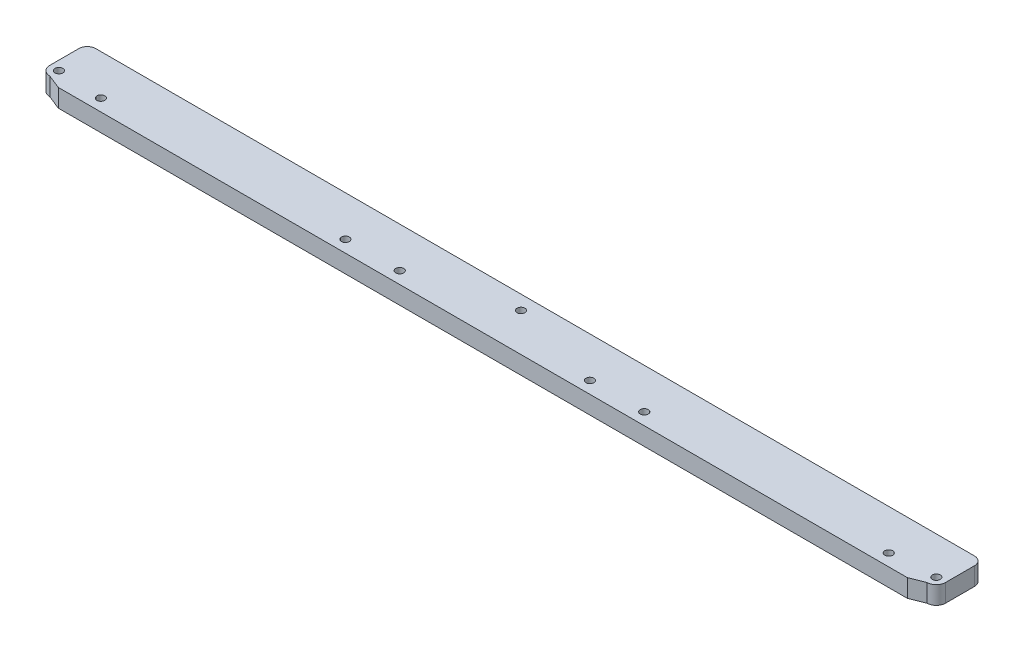
ISO-10303-21;
HEADER;
FILE_DESCRIPTION(('STEP AP214'),'2;1');
FILE_NAME('part.step','',(''),(''),'','','');
FILE_SCHEMA(('AUTOMOTIVE_DESIGN { 1 0 10303 214 1 1 1 1 }'));
ENDSEC;
DATA;
#1=APPLICATION_CONTEXT('core data for automotive mechanical design processes');
#2=APPLICATION_PROTOCOL_DEFINITION('international standard','automotive_design',2000,#1);
#3=PRODUCT_CONTEXT('',#1,'mechanical');
#4=PRODUCT('Part','Part','',(#3));
#5=PRODUCT_RELATED_PRODUCT_CATEGORY('part','',(#4));
#6=PRODUCT_DEFINITION_FORMATION('','',#4);
#7=PRODUCT_DEFINITION_CONTEXT('part definition',#1,'design');
#8=PRODUCT_DEFINITION('design','',#6,#7);
#9=PRODUCT_DEFINITION_SHAPE('','',#8);
#10=(LENGTH_UNIT() NAMED_UNIT(*) SI_UNIT(.MILLI.,.METRE.));
#11=(NAMED_UNIT(*) PLANE_ANGLE_UNIT() SI_UNIT($,.RADIAN.));
#12=(NAMED_UNIT(*) SI_UNIT($,.STERADIAN.) SOLID_ANGLE_UNIT());
#13=UNCERTAINTY_MEASURE_WITH_UNIT(LENGTH_MEASURE(1.E-05),#10,'distance_accuracy_value','');
#14=(GEOMETRIC_REPRESENTATION_CONTEXT(3) GLOBAL_UNCERTAINTY_ASSIGNED_CONTEXT((#13)) GLOBAL_UNIT_ASSIGNED_CONTEXT((#10,
#11,#12)) REPRESENTATION_CONTEXT('',''));
#15=CARTESIAN_POINT('',(0.,0.,0.));
#16=DIRECTION('',(0.,0.,1.));
#17=DIRECTION('',(1.,0.,0.));
#18=AXIS2_PLACEMENT_3D('',#15,#16,#17);
#19=CARTESIAN_POINT('',(0.,6.35,5.25000000000001));
#20=DIRECTION('',(0.,0.,-1.));
#21=DIRECTION('',(-1.,0.,0.));
#22=AXIS2_PLACEMENT_3D('',#19,#20,#21);
#23=PLANE('',#22);
#24=DIRECTION('',(1.,0.,0.));
#25=VECTOR('',#24,1.);
#26=CARTESIAN_POINT('',(0.,0.,5.25000000000001));
#27=LINE('',#26,#25);
#28=CARTESIAN_POINT('',(-150.,0.,5.25000000000001));
#29=VERTEX_POINT('',#28);
#30=CARTESIAN_POINT('',(150.,0.,5.25000000000001));
#31=VERTEX_POINT('',#30);
#32=EDGE_CURVE('E142',#29,#31,#27,.T.);
#33=ORIENTED_EDGE('',*,*,#32,.T.);
#34=DIRECTION('',(0.,-1.,0.));
#35=VECTOR('',#34,1.);
#36=CARTESIAN_POINT('',(150.,6.35,5.25000000000001));
#37=LINE('',#36,#35);
#38=CARTESIAN_POINT('',(150.,6.35,5.25000000000001));
#39=VERTEX_POINT('',#38);
#40=EDGE_CURVE('E124',#39,#31,#37,.T.);
#41=ORIENTED_EDGE('',*,*,#40,.F.);
#42=DIRECTION('',(1.,0.,0.));
#43=VECTOR('',#42,1.);
#44=CARTESIAN_POINT('',(0.,6.35,5.25000000000001));
#45=LINE('',#44,#43);
#46=CARTESIAN_POINT('',(-150.,6.35,5.25000000000001));
#47=VERTEX_POINT('',#46);
#48=EDGE_CURVE('E130',#47,#39,#45,.T.);
#49=ORIENTED_EDGE('',*,*,#48,.F.);
#50=DIRECTION('',(0.,-1.,0.));
#51=VECTOR('',#50,1.);
#52=CARTESIAN_POINT('',(-150.,6.35,5.25000000000001));
#53=LINE('',#52,#51);
#54=EDGE_CURVE('E204',#47,#29,#53,.T.);
#55=ORIENTED_EDGE('',*,*,#54,.T.);
#56=EDGE_LOOP('',(#33,#41,#49,#55));
#57=FACE_BOUND('',#56,.T.);
#58=ADVANCED_FACE('F39',(#57),#23,.F.);
#59=CARTESIAN_POINT('',(22.4999999999998,6.35,56.2499999999998));
#60=DIRECTION('',(-0.371390676354102,0.,-0.92847669088526));
#61=DIRECTION('',(-0.92847669088526,0.,0.371390676354102));
#62=AXIS2_PLACEMENT_3D('',#59,#60,#61);
#63=PLANE('',#62);
#64=DIRECTION('',(0.92847669088526,0.,-0.371390676354102));
#65=VECTOR('',#64,1.);
#66=CARTESIAN_POINT('',(22.4999999999998,0.,56.2499999999998));
#67=LINE('',#66,#65);
#68=CARTESIAN_POINT('',(155.,0.,3.25000000000001));
#69=VERTEX_POINT('',#68);
#70=EDGE_CURVE('E186',#31,#69,#67,.T.);
#71=ORIENTED_EDGE('',*,*,#70,.T.);
#72=DIRECTION('',(0.,-1.,0.));
#73=VECTOR('',#72,1.);
#74=CARTESIAN_POINT('',(155.,6.35,3.25000000000001));
#75=LINE('',#74,#73);
#76=CARTESIAN_POINT('',(155.,6.35,3.25000000000001));
#77=VERTEX_POINT('',#76);
#78=EDGE_CURVE('E126',#77,#69,#75,.T.);
#79=ORIENTED_EDGE('',*,*,#78,.F.);
#80=DIRECTION('',(0.92847669088526,0.,-0.371390676354102));
#81=VECTOR('',#80,1.);
#82=CARTESIAN_POINT('',(22.4999999999998,6.35,56.2499999999998));
#83=LINE('',#82,#81);
#84=EDGE_CURVE('E119',#39,#77,#83,.T.);
#85=ORIENTED_EDGE('',*,*,#84,.F.);
#86=ORIENTED_EDGE('',*,*,#40,.T.);
#87=EDGE_LOOP('',(#71,#79,#85,#86));
#88=FACE_BOUND('',#87,.T.);
#89=ADVANCED_FACE('F122',(#88),#63,.F.);
#90=CARTESIAN_POINT('',(155.,6.35,0.));
#91=DIRECTION('',(0.,-1.,0.));
#92=DIRECTION('',(0.,0.,-1.));
#93=AXIS2_PLACEMENT_3D('',#90,#91,#92);
#94=CYLINDRICAL_SURFACE('',#93,3.25000000000001);
#95=CARTESIAN_POINT('',(155.,0.,0.));
#96=DIRECTION('',(0.,1.,0.));
#97=DIRECTION('',(0.,0.,1.));
#98=AXIS2_PLACEMENT_3D('',#95,#96,#97);
#99=CIRCLE('',#98,3.25000000000001);
#100=CARTESIAN_POINT('',(158.25,0.,0.));
#101=VERTEX_POINT('',#100);
#102=EDGE_CURVE('E182',#101,#69,#99,.F.);
#103=ORIENTED_EDGE('',*,*,#102,.F.);
#104=DIRECTION('',(0.,-1.,0.));
#105=VECTOR('',#104,1.);
#106=CARTESIAN_POINT('',(158.25,6.35,0.));
#107=LINE('',#106,#105);
#108=CARTESIAN_POINT('',(158.25,6.35,0.));
#109=VERTEX_POINT('',#108);
#110=EDGE_CURVE('E147',#109,#101,#107,.T.);
#111=ORIENTED_EDGE('',*,*,#110,.F.);
#112=CARTESIAN_POINT('',(155.,6.35,0.));
#113=DIRECTION('',(0.,1.,0.));
#114=DIRECTION('',(0.,0.,1.));
#115=AXIS2_PLACEMENT_3D('',#112,#113,#114);
#116=CIRCLE('',#115,3.25000000000001);
#117=EDGE_CURVE('E129',#109,#77,#116,.F.);
#118=ORIENTED_EDGE('',*,*,#117,.T.);
#119=ORIENTED_EDGE('',*,*,#78,.T.);
#120=EDGE_LOOP('',(#103,#111,#118,#119));
#121=FACE_BOUND('',#120,.T.);
#122=ADVANCED_FACE('F236',(#121),#94,.T.);
#123=CARTESIAN_POINT('',(158.25,6.35,0.));
#124=DIRECTION('',(1.,0.,0.));
#125=DIRECTION('',(0.,0.,-1.));
#126=AXIS2_PLACEMENT_3D('',#123,#124,#125);
#127=PLANE('',#126);
#128=DIRECTION('',(0.,0.,1.));
#129=VECTOR('',#128,1.);
#130=CARTESIAN_POINT('',(158.25,0.,0.));
#131=LINE('',#130,#129);
#132=CARTESIAN_POINT('',(158.25,0.,-10.25));
#133=VERTEX_POINT('',#132);
#134=EDGE_CURVE('E176',#133,#101,#131,.T.);
#135=ORIENTED_EDGE('',*,*,#134,.F.);
#136=DIRECTION('',(0.,-1.,0.));
#137=VECTOR('',#136,1.);
#138=CARTESIAN_POINT('',(158.25,6.35,-10.25));
#139=LINE('',#138,#137);
#140=CARTESIAN_POINT('',(158.25,6.35,-10.25));
#141=VERTEX_POINT('',#140);
#142=EDGE_CURVE('E62',#133,#141,#139,.F.);
#143=ORIENTED_EDGE('',*,*,#142,.T.);
#144=DIRECTION('',(0.,0.,1.));
#145=VECTOR('',#144,1.);
#146=CARTESIAN_POINT('',(158.25,6.35,0.));
#147=LINE('',#146,#145);
#148=EDGE_CURVE('E161',#141,#109,#147,.T.);
#149=ORIENTED_EDGE('',*,*,#148,.T.);
#150=ORIENTED_EDGE('',*,*,#110,.T.);
#151=EDGE_LOOP('',(#135,#143,#149,#150));
#152=FACE_BOUND('',#151,.T.);
#153=ADVANCED_FACE('F179',(#152),#127,.T.);
#154=CARTESIAN_POINT('',(0.,6.35,-13.25));
#155=DIRECTION('',(0.,0.,-1.));
#156=DIRECTION('',(-1.,0.,0.));
#157=AXIS2_PLACEMENT_3D('',#154,#155,#156);
#158=PLANE('',#157);
#159=DIRECTION('',(1.,0.,0.));
#160=VECTOR('',#159,1.);
#161=CARTESIAN_POINT('',(0.,6.35,-13.25));
#162=LINE('',#161,#160);
#163=CARTESIAN_POINT('',(-155.25,6.35,-13.25));
#164=VERTEX_POINT('',#163);
#165=CARTESIAN_POINT('',(155.25,6.35,-13.25));
#166=VERTEX_POINT('',#165);
#167=EDGE_CURVE('E160',#164,#166,#162,.T.);
#168=ORIENTED_EDGE('',*,*,#167,.T.);
#169=DIRECTION('',(0.,-1.,0.));
#170=VECTOR('',#169,1.);
#171=CARTESIAN_POINT('',(155.25,6.35,-13.25));
#172=LINE('',#171,#170);
#173=CARTESIAN_POINT('',(155.25,0.,-13.25));
#174=VERTEX_POINT('',#173);
#175=EDGE_CURVE('E145',#166,#174,#172,.T.);
#176=ORIENTED_EDGE('',*,*,#175,.T.);
#177=DIRECTION('',(1.,0.,0.));
#178=VECTOR('',#177,1.);
#179=CARTESIAN_POINT('',(0.,0.,-13.25));
#180=LINE('',#179,#178);
#181=CARTESIAN_POINT('',(-155.25,0.,-13.25));
#182=VERTEX_POINT('',#181);
#183=EDGE_CURVE('E178',#182,#174,#180,.T.);
#184=ORIENTED_EDGE('',*,*,#183,.F.);
#185=DIRECTION('',(0.,-1.,0.));
#186=VECTOR('',#185,1.);
#187=CARTESIAN_POINT('',(-155.25,6.35,-13.25));
#188=LINE('',#187,#186);
#189=EDGE_CURVE('E143',#182,#164,#188,.F.);
#190=ORIENTED_EDGE('',*,*,#189,.T.);
#191=EDGE_LOOP('',(#168,#176,#184,#190));
#192=FACE_BOUND('',#191,.T.);
#193=ADVANCED_FACE('F165',(#192),#158,.T.);
#194=CARTESIAN_POINT('',(-158.25,6.35,0.));
#195=DIRECTION('',(-1.,0.,0.));
#196=DIRECTION('',(0.,0.,1.));
#197=AXIS2_PLACEMENT_3D('',#194,#195,#196);
#198=PLANE('',#197);
#199=DIRECTION('',(0.,0.,-1.));
#200=VECTOR('',#199,1.);
#201=CARTESIAN_POINT('',(-158.25,6.35,0.));
#202=LINE('',#201,#200);
#203=CARTESIAN_POINT('',(-158.25,6.35,0.));
#204=VERTEX_POINT('',#203);
#205=CARTESIAN_POINT('',(-158.25,6.35,-10.25));
#206=VERTEX_POINT('',#205);
#207=EDGE_CURVE('E169',#204,#206,#202,.T.);
#208=ORIENTED_EDGE('',*,*,#207,.T.);
#209=DIRECTION('',(0.,-1.,0.));
#210=VECTOR('',#209,1.);
#211=CARTESIAN_POINT('',(-158.25,6.35,-10.25));
#212=LINE('',#211,#210);
#213=CARTESIAN_POINT('',(-158.25,0.,-10.25));
#214=VERTEX_POINT('',#213);
#215=EDGE_CURVE('E11',#206,#214,#212,.T.);
#216=ORIENTED_EDGE('',*,*,#215,.T.);
#217=DIRECTION('',(0.,0.,-1.));
#218=VECTOR('',#217,1.);
#219=CARTESIAN_POINT('',(-158.25,0.,0.));
#220=LINE('',#219,#218);
#221=CARTESIAN_POINT('',(-158.25,0.,0.));
#222=VERTEX_POINT('',#221);
#223=EDGE_CURVE('E184',#222,#214,#220,.T.);
#224=ORIENTED_EDGE('',*,*,#223,.F.);
#225=DIRECTION('',(0.,-1.,0.));
#226=VECTOR('',#225,1.);
#227=CARTESIAN_POINT('',(-158.25,6.35,0.));
#228=LINE('',#227,#226);
#229=EDGE_CURVE('E209',#204,#222,#228,.T.);
#230=ORIENTED_EDGE('',*,*,#229,.F.);
#231=EDGE_LOOP('',(#208,#216,#224,#230));
#232=FACE_BOUND('',#231,.T.);
#233=ADVANCED_FACE('F219',(#232),#198,.T.);
#234=CARTESIAN_POINT('',(-155.,6.35,0.));
#235=DIRECTION('',(0.,-1.,0.));
#236=DIRECTION('',(0.,0.,-1.));
#237=AXIS2_PLACEMENT_3D('',#234,#235,#236);
#238=CYLINDRICAL_SURFACE('',#237,3.25000000000001);
#239=CARTESIAN_POINT('',(-155.,0.,0.));
#240=DIRECTION('',(0.,1.,0.));
#241=DIRECTION('',(0.,0.,1.));
#242=AXIS2_PLACEMENT_3D('',#239,#240,#241);
#243=CIRCLE('',#242,3.25000000000001);
#244=CARTESIAN_POINT('',(-155.,0.,3.25000000000001));
#245=VERTEX_POINT('',#244);
#246=EDGE_CURVE('E192',#222,#245,#243,.T.);
#247=ORIENTED_EDGE('',*,*,#246,.T.);
#248=DIRECTION('',(0.,-1.,0.));
#249=VECTOR('',#248,1.);
#250=CARTESIAN_POINT('',(-155.,6.35,3.25000000000001));
#251=LINE('',#250,#249);
#252=CARTESIAN_POINT('',(-155.,6.35,3.25000000000001));
#253=VERTEX_POINT('',#252);
#254=EDGE_CURVE('E206',#253,#245,#251,.T.);
#255=ORIENTED_EDGE('',*,*,#254,.F.);
#256=CARTESIAN_POINT('',(-155.,6.35,0.));
#257=DIRECTION('',(0.,1.,0.));
#258=DIRECTION('',(0.,0.,1.));
#259=AXIS2_PLACEMENT_3D('',#256,#257,#258);
#260=CIRCLE('',#259,3.25000000000001);
#261=EDGE_CURVE('E215',#204,#253,#260,.T.);
#262=ORIENTED_EDGE('',*,*,#261,.F.);
#263=ORIENTED_EDGE('',*,*,#229,.T.);
#264=EDGE_LOOP('',(#247,#255,#262,#263));
#265=FACE_BOUND('',#264,.T.);
#266=ADVANCED_FACE('F213',(#265),#238,.T.);
#267=CARTESIAN_POINT('',(-155.,6.35,0.));
#268=DIRECTION('',(0.,-1.,0.));
#269=DIRECTION('',(0.,0.,-1.));
#270=AXIS2_PLACEMENT_3D('',#267,#268,#269);
#271=CYLINDRICAL_SURFACE('',#270,1.4);
#272=CARTESIAN_POINT('',(-155.,6.35,0.));
#273=DIRECTION('',(0.,1.,0.));
#274=DIRECTION('',(0.,0.,1.));
#275=AXIS2_PLACEMENT_3D('',#272,#273,#274);
#276=CIRCLE('',#275,1.4);
#277=CARTESIAN_POINT('',(-155.,6.35,1.4));
#278=VERTEX_POINT('',#277);
#279=EDGE_CURVE('E275',#278,#278,#276,.T.);
#280=ORIENTED_EDGE('',*,*,#279,.T.);
#281=EDGE_LOOP('',(#280));
#282=FACE_BOUND('',#281,.T.);
#283=CARTESIAN_POINT('',(-155.,0.,0.));
#284=DIRECTION('',(0.,1.,0.));
#285=DIRECTION('',(0.,0.,1.));
#286=AXIS2_PLACEMENT_3D('',#283,#284,#285);
#287=CIRCLE('',#286,1.4);
#288=CARTESIAN_POINT('',(-155.,0.,1.4));
#289=VERTEX_POINT('',#288);
#290=EDGE_CURVE('E198',#289,#289,#287,.T.);
#291=ORIENTED_EDGE('',*,*,#290,.F.);
#292=EDGE_LOOP('',(#291));
#293=FACE_BOUND('',#292,.T.);
#294=ADVANCED_FACE('F251',(#282,#293),#271,.F.);
#295=CARTESIAN_POINT('',(-22.4999999999993,6.35,56.2499999999994));
#296=DIRECTION('',(-0.371390676354098,0.,0.928476690885262));
#297=DIRECTION('',(0.928476690885262,0.,0.371390676354098));
#298=AXIS2_PLACEMENT_3D('',#295,#296,#297);
#299=PLANE('',#298);
#300=DIRECTION('',(-0.928476690885262,0.,-0.371390676354098));
#301=VECTOR('',#300,1.);
#302=CARTESIAN_POINT('',(-22.4999999999993,0.,56.2499999999994));
#303=LINE('',#302,#301);
#304=EDGE_CURVE('E195',#29,#245,#303,.T.);
#305=ORIENTED_EDGE('',*,*,#304,.F.);
#306=ORIENTED_EDGE('',*,*,#54,.F.);
#307=DIRECTION('',(-0.928476690885262,0.,-0.371390676354098));
#308=VECTOR('',#307,1.);
#309=CARTESIAN_POINT('',(-22.4999999999993,6.35,56.2499999999994));
#310=LINE('',#309,#308);
#311=EDGE_CURVE('E137',#47,#253,#310,.T.);
#312=ORIENTED_EDGE('',*,*,#311,.T.);
#313=ORIENTED_EDGE('',*,*,#254,.T.);
#314=EDGE_LOOP('',(#305,#306,#312,#313));
#315=FACE_BOUND('',#314,.T.);
#316=ADVANCED_FACE('F243',(#315),#299,.T.);
#317=CARTESIAN_POINT('',(155.,6.35,0.));
#318=DIRECTION('',(0.,-1.,0.));
#319=DIRECTION('',(0.,0.,-1.));
#320=AXIS2_PLACEMENT_3D('',#317,#318,#319);
#321=CYLINDRICAL_SURFACE('',#320,1.4);
#322=CARTESIAN_POINT('',(155.,6.35,0.));
#323=DIRECTION('',(0.,1.,0.));
#324=DIRECTION('',(0.,0.,1.));
#325=AXIS2_PLACEMENT_3D('',#322,#323,#324);
#326=CIRCLE('',#325,1.4);
#327=CARTESIAN_POINT('',(155.,6.35,1.4));
#328=VERTEX_POINT('',#327);
#329=EDGE_CURVE('E139',#328,#328,#326,.T.);
#330=ORIENTED_EDGE('',*,*,#329,.T.);
#331=EDGE_LOOP('',(#330));
#332=FACE_BOUND('',#331,.T.);
#333=CARTESIAN_POINT('',(155.,0.,0.));
#334=DIRECTION('',(0.,1.,0.));
#335=DIRECTION('',(0.,0.,1.));
#336=AXIS2_PLACEMENT_3D('',#333,#334,#335);
#337=CIRCLE('',#336,1.4);
#338=CARTESIAN_POINT('',(155.,0.,1.4));
#339=VERTEX_POINT('',#338);
#340=EDGE_CURVE('E259',#339,#339,#337,.T.);
#341=ORIENTED_EDGE('',*,*,#340,.F.);
#342=EDGE_LOOP('',(#341));
#343=FACE_BOUND('',#342,.T.);
#344=ADVANCED_FACE('F240',(#332,#343),#321,.F.);
#345=CARTESIAN_POINT('',(0.,6.35,-8.25000000000001));
#346=DIRECTION('',(0.,-1.,0.));
#347=DIRECTION('',(0.,0.,-1.));
#348=AXIS2_PLACEMENT_3D('',#345,#346,#347);
#349=CYLINDRICAL_SURFACE('',#348,1.4);
#350=CARTESIAN_POINT('',(0.,6.35,-8.25000000000001));
#351=DIRECTION('',(0.,1.,0.));
#352=DIRECTION('',(0.,0.,1.));
#353=AXIS2_PLACEMENT_3D('',#350,#351,#352);
#354=CIRCLE('',#353,1.4);
#355=CARTESIAN_POINT('',(0.,6.35,-6.85000000000001));
#356=VERTEX_POINT('',#355);
#357=EDGE_CURVE('E207',#356,#356,#354,.T.);
#358=ORIENTED_EDGE('',*,*,#357,.T.);
#359=EDGE_LOOP('',(#358));
#360=FACE_BOUND('',#359,.T.);
#361=CARTESIAN_POINT('',(0.,0.,-8.25000000000001));
#362=DIRECTION('',(0.,1.,0.));
#363=DIRECTION('',(0.,0.,1.));
#364=AXIS2_PLACEMENT_3D('',#361,#362,#363);
#365=CIRCLE('',#364,1.4);
#366=CARTESIAN_POINT('',(0.,0.,-6.85000000000001));
#367=VERTEX_POINT('',#366);
#368=EDGE_CURVE('E201',#367,#367,#365,.T.);
#369=ORIENTED_EDGE('',*,*,#368,.F.);
#370=EDGE_LOOP('',(#369));
#371=FACE_BOUND('',#370,.T.);
#372=ADVANCED_FACE('F242',(#360,#371),#349,.F.);
#373=CARTESIAN_POINT('',(0.,6.35,0.));
#374=DIRECTION('',(0.,1.,0.));
#375=DIRECTION('',(0.,0.,1.));
#376=AXIS2_PLACEMENT_3D('',#373,#374,#375);
#377=PLANE('',#376);
#378=CARTESIAN_POINT('',(33.6,6.35,0.999999999999979));
#379=DIRECTION('',(0.,1.,0.));
#380=DIRECTION('',(0.,0.,-1.));
#381=AXIS2_PLACEMENT_3D('',#378,#379,#380);
#382=CIRCLE('',#381,1.4);
#383=CARTESIAN_POINT('',(33.6,6.35,-0.400000000000017));
#384=VERTEX_POINT('',#383);
#385=EDGE_CURVE('E468',#384,#384,#382,.T.);
#386=ORIENTED_EDGE('',*,*,#385,.F.);
#387=EDGE_LOOP('',(#386));
#388=FACE_BOUND('',#387,.T.);
#389=CARTESIAN_POINT('',(52.8,6.35,0.999999999999974));
#390=DIRECTION('',(0.,1.,0.));
#391=DIRECTION('',(0.,0.,-1.));
#392=AXIS2_PLACEMENT_3D('',#389,#390,#391);
#393=CIRCLE('',#392,1.4);
#394=CARTESIAN_POINT('',(52.8,6.35,-0.400000000000029));
#395=VERTEX_POINT('',#394);
#396=EDGE_CURVE('E470',#395,#395,#393,.T.);
#397=ORIENTED_EDGE('',*,*,#396,.F.);
#398=EDGE_LOOP('',(#397));
#399=FACE_BOUND('',#398,.T.);
#400=CARTESIAN_POINT('',(139.2,6.35,0.999999999999921));
#401=DIRECTION('',(0.,1.,0.));
#402=DIRECTION('',(0.,0.,-1.));
#403=AXIS2_PLACEMENT_3D('',#400,#401,#402);
#404=CIRCLE('',#403,1.4);
#405=CARTESIAN_POINT('',(139.2,6.35,-0.400000000000082));
#406=VERTEX_POINT('',#405);
#407=EDGE_CURVE('E476',#406,#406,#404,.T.);
#408=ORIENTED_EDGE('',*,*,#407,.F.);
#409=EDGE_LOOP('',(#408));
#410=FACE_BOUND('',#409,.T.);
#411=CARTESIAN_POINT('',(-139.2,6.35,0.999999999999955));
#412=DIRECTION('',(0.,1.,0.));
#413=DIRECTION('',(0.,0.,1.));
#414=AXIS2_PLACEMENT_3D('',#411,#412,#413);
#415=CIRCLE('',#414,1.4);
#416=CARTESIAN_POINT('',(-139.2,6.35,2.39999999999996));
#417=VERTEX_POINT('',#416);
#418=EDGE_CURVE('E482',#417,#417,#415,.T.);
#419=ORIENTED_EDGE('',*,*,#418,.F.);
#420=EDGE_LOOP('',(#419));
#421=FACE_BOUND('',#420,.T.);
#422=CARTESIAN_POINT('',(-52.8,6.35,0.999999999999987));
#423=DIRECTION('',(0.,1.,0.));
#424=DIRECTION('',(0.,0.,1.));
#425=AXIS2_PLACEMENT_3D('',#422,#423,#424);
#426=CIRCLE('',#425,1.4);
#427=CARTESIAN_POINT('',(-52.8,6.35,2.39999999999999));
#428=VERTEX_POINT('',#427);
#429=EDGE_CURVE('E488',#428,#428,#426,.T.);
#430=ORIENTED_EDGE('',*,*,#429,.F.);
#431=EDGE_LOOP('',(#430));
#432=FACE_BOUND('',#431,.T.);
#433=CARTESIAN_POINT('',(-33.6,6.35,0.999999999999987));
#434=DIRECTION('',(0.,1.,0.));
#435=DIRECTION('',(0.,0.,1.));
#436=AXIS2_PLACEMENT_3D('',#433,#434,#435);
#437=CIRCLE('',#436,1.4);
#438=CARTESIAN_POINT('',(-33.6,6.35,2.39999999999998));
#439=VERTEX_POINT('',#438);
#440=EDGE_CURVE('E265',#439,#439,#437,.T.);
#441=ORIENTED_EDGE('',*,*,#440,.F.);
#442=EDGE_LOOP('',(#441));
#443=FACE_BOUND('',#442,.T.);
#444=ORIENTED_EDGE('',*,*,#329,.F.);
#445=EDGE_LOOP('',(#444));
#446=FACE_BOUND('',#445,.T.);
#447=ORIENTED_EDGE('',*,*,#148,.F.);
#448=CARTESIAN_POINT('',(155.25,6.35,-10.25));
#449=DIRECTION('',(0.,1.,0.));
#450=DIRECTION('',(0.,0.,1.));
#451=AXIS2_PLACEMENT_3D('',#448,#449,#450);
#452=CIRCLE('',#451,3.);
#453=EDGE_CURVE('E47',#141,#166,#452,.T.);
#454=ORIENTED_EDGE('',*,*,#453,.T.);
#455=ORIENTED_EDGE('',*,*,#167,.F.);
#456=CARTESIAN_POINT('',(-155.25,6.35,-10.25));
#457=DIRECTION('',(0.,1.,0.));
#458=DIRECTION('',(0.,0.,1.));
#459=AXIS2_PLACEMENT_3D('',#456,#457,#458);
#460=CIRCLE('',#459,3.);
#461=EDGE_CURVE('E54',#164,#206,#460,.T.);
#462=ORIENTED_EDGE('',*,*,#461,.T.);
#463=ORIENTED_EDGE('',*,*,#207,.F.);
#464=ORIENTED_EDGE('',*,*,#261,.T.);
#465=ORIENTED_EDGE('',*,*,#311,.F.);
#466=ORIENTED_EDGE('',*,*,#48,.T.);
#467=ORIENTED_EDGE('',*,*,#84,.T.);
#468=ORIENTED_EDGE('',*,*,#117,.F.);
#469=EDGE_LOOP('',(#447,#454,#455,#462,#463,#464,#465,#466,#467,#468));
#470=FACE_BOUND('',#469,.T.);
#471=ORIENTED_EDGE('',*,*,#279,.F.);
#472=EDGE_LOOP('',(#471));
#473=FACE_BOUND('',#472,.T.);
#474=ORIENTED_EDGE('',*,*,#357,.F.);
#475=EDGE_LOOP('',(#474));
#476=FACE_BOUND('',#475,.T.);
#477=ADVANCED_FACE('F134',(#388,#399,#410,#421,#432,#443,#446,#470,#473,#476),#377,.T.);
#478=CARTESIAN_POINT('',(0.,0.,0.));
#479=DIRECTION('',(0.,1.,0.));
#480=DIRECTION('',(0.,0.,1.));
#481=AXIS2_PLACEMENT_3D('',#478,#479,#480);
#482=PLANE('',#481);
#483=CARTESIAN_POINT('',(33.6,0.,0.999999999999979));
#484=DIRECTION('',(0.,1.,0.));
#485=DIRECTION('',(0.,0.,-1.));
#486=AXIS2_PLACEMENT_3D('',#483,#484,#485);
#487=CIRCLE('',#486,1.4);
#488=CARTESIAN_POINT('',(33.6,0.,-0.400000000000017));
#489=VERTEX_POINT('',#488);
#490=EDGE_CURVE('E466',#489,#489,#487,.T.);
#491=ORIENTED_EDGE('',*,*,#490,.T.);
#492=EDGE_LOOP('',(#491));
#493=FACE_BOUND('',#492,.T.);
#494=CARTESIAN_POINT('',(52.8,0.,0.999999999999974));
#495=DIRECTION('',(0.,1.,0.));
#496=DIRECTION('',(0.,0.,-1.));
#497=AXIS2_PLACEMENT_3D('',#494,#495,#496);
#498=CIRCLE('',#497,1.4);
#499=CARTESIAN_POINT('',(52.8,0.,-0.400000000000029));
#500=VERTEX_POINT('',#499);
#501=EDGE_CURVE('E473',#500,#500,#498,.T.);
#502=ORIENTED_EDGE('',*,*,#501,.T.);
#503=EDGE_LOOP('',(#502));
#504=FACE_BOUND('',#503,.T.);
#505=CARTESIAN_POINT('',(139.2,0.,0.999999999999921));
#506=DIRECTION('',(0.,1.,0.));
#507=DIRECTION('',(0.,0.,-1.));
#508=AXIS2_PLACEMENT_3D('',#505,#506,#507);
#509=CIRCLE('',#508,1.4);
#510=CARTESIAN_POINT('',(139.2,0.,-0.400000000000082));
#511=VERTEX_POINT('',#510);
#512=EDGE_CURVE('E479',#511,#511,#509,.T.);
#513=ORIENTED_EDGE('',*,*,#512,.T.);
#514=EDGE_LOOP('',(#513));
#515=FACE_BOUND('',#514,.T.);
#516=CARTESIAN_POINT('',(-139.2,0.,0.999999999999955));
#517=DIRECTION('',(0.,1.,0.));
#518=DIRECTION('',(0.,0.,1.));
#519=AXIS2_PLACEMENT_3D('',#516,#517,#518);
#520=CIRCLE('',#519,1.4);
#521=CARTESIAN_POINT('',(-139.2,0.,2.39999999999996));
#522=VERTEX_POINT('',#521);
#523=EDGE_CURVE('E485',#522,#522,#520,.T.);
#524=ORIENTED_EDGE('',*,*,#523,.T.);
#525=EDGE_LOOP('',(#524));
#526=FACE_BOUND('',#525,.T.);
#527=CARTESIAN_POINT('',(-52.8,0.,0.999999999999987));
#528=DIRECTION('',(0.,1.,0.));
#529=DIRECTION('',(0.,0.,1.));
#530=AXIS2_PLACEMENT_3D('',#527,#528,#529);
#531=CIRCLE('',#530,1.4);
#532=CARTESIAN_POINT('',(-52.8,0.,2.39999999999999));
#533=VERTEX_POINT('',#532);
#534=EDGE_CURVE('E491',#533,#533,#531,.T.);
#535=ORIENTED_EDGE('',*,*,#534,.T.);
#536=EDGE_LOOP('',(#535));
#537=FACE_BOUND('',#536,.T.);
#538=CARTESIAN_POINT('',(-33.6,0.,0.999999999999987));
#539=DIRECTION('',(0.,1.,0.));
#540=DIRECTION('',(0.,0.,1.));
#541=AXIS2_PLACEMENT_3D('',#538,#539,#540);
#542=CIRCLE('',#541,1.4);
#543=CARTESIAN_POINT('',(-33.6,0.,2.39999999999998));
#544=VERTEX_POINT('',#543);
#545=EDGE_CURVE('E261',#544,#544,#542,.T.);
#546=ORIENTED_EDGE('',*,*,#545,.T.);
#547=EDGE_LOOP('',(#546));
#548=FACE_BOUND('',#547,.T.);
#549=ORIENTED_EDGE('',*,*,#340,.T.);
#550=EDGE_LOOP('',(#549));
#551=FACE_BOUND('',#550,.T.);
#552=ORIENTED_EDGE('',*,*,#183,.T.);
#553=CARTESIAN_POINT('',(155.25,0.,-10.25));
#554=DIRECTION('',(0.,1.,0.));
#555=DIRECTION('',(0.,0.,1.));
#556=AXIS2_PLACEMENT_3D('',#553,#554,#555);
#557=CIRCLE('',#556,3.);
#558=EDGE_CURVE('E155',#174,#133,#557,.F.);
#559=ORIENTED_EDGE('',*,*,#558,.T.);
#560=ORIENTED_EDGE('',*,*,#134,.T.);
#561=ORIENTED_EDGE('',*,*,#102,.T.);
#562=ORIENTED_EDGE('',*,*,#70,.F.);
#563=ORIENTED_EDGE('',*,*,#32,.F.);
#564=ORIENTED_EDGE('',*,*,#304,.T.);
#565=ORIENTED_EDGE('',*,*,#246,.F.);
#566=ORIENTED_EDGE('',*,*,#223,.T.);
#567=CARTESIAN_POINT('',(-155.25,0.,-10.25));
#568=DIRECTION('',(0.,1.,0.));
#569=DIRECTION('',(0.,0.,1.));
#570=AXIS2_PLACEMENT_3D('',#567,#568,#569);
#571=CIRCLE('',#570,3.);
#572=EDGE_CURVE('E153',#214,#182,#571,.F.);
#573=ORIENTED_EDGE('',*,*,#572,.T.);
#574=EDGE_LOOP('',(#552,#559,#560,#561,#562,#563,#564,#565,#566,#573));
#575=FACE_BOUND('',#574,.T.);
#576=ORIENTED_EDGE('',*,*,#290,.T.);
#577=EDGE_LOOP('',(#576));
#578=FACE_BOUND('',#577,.T.);
#579=ORIENTED_EDGE('',*,*,#368,.T.);
#580=EDGE_LOOP('',(#579));
#581=FACE_BOUND('',#580,.T.);
#582=ADVANCED_FACE('F173',(#493,#504,#515,#526,#537,#548,#551,#575,#578,#581),#482,.F.);
#583=CARTESIAN_POINT('',(155.25,6.35,-10.25));
#584=DIRECTION('',(0.,-1.,0.));
#585=DIRECTION('',(0.,0.,-1.));
#586=AXIS2_PLACEMENT_3D('',#583,#584,#585);
#587=CYLINDRICAL_SURFACE('',#586,3.);
#588=ORIENTED_EDGE('',*,*,#453,.F.);
#589=ORIENTED_EDGE('',*,*,#142,.F.);
#590=ORIENTED_EDGE('',*,*,#558,.F.);
#591=ORIENTED_EDGE('',*,*,#175,.F.);
#592=EDGE_LOOP('',(#588,#589,#590,#591));
#593=FACE_BOUND('',#592,.T.);
#594=ADVANCED_FACE('F171',(#593),#587,.T.);
#595=CARTESIAN_POINT('',(-155.25,6.35,-10.25));
#596=DIRECTION('',(0.,-1.,0.));
#597=DIRECTION('',(0.,0.,-1.));
#598=AXIS2_PLACEMENT_3D('',#595,#596,#597);
#599=CYLINDRICAL_SURFACE('',#598,3.);
#600=ORIENTED_EDGE('',*,*,#461,.F.);
#601=ORIENTED_EDGE('',*,*,#189,.F.);
#602=ORIENTED_EDGE('',*,*,#572,.F.);
#603=ORIENTED_EDGE('',*,*,#215,.F.);
#604=EDGE_LOOP('',(#600,#601,#602,#603));
#605=FACE_BOUND('',#604,.T.);
#606=ADVANCED_FACE('F41',(#605),#599,.T.);
#607=CARTESIAN_POINT('',(-33.6,0.,0.999999999999987));
#608=DIRECTION('',(0.,1.,0.));
#609=DIRECTION('',(0.,0.,1.));
#610=AXIS2_PLACEMENT_3D('',#607,#608,#609);
#611=CYLINDRICAL_SURFACE('',#610,1.4);
#612=ORIENTED_EDGE('',*,*,#545,.F.);
#613=EDGE_LOOP('',(#612));
#614=FACE_BOUND('',#613,.T.);
#615=ORIENTED_EDGE('',*,*,#440,.T.);
#616=EDGE_LOOP('',(#615));
#617=FACE_BOUND('',#616,.T.);
#618=ADVANCED_FACE('F223',(#614,#617),#611,.F.);
#619=CARTESIAN_POINT('',(-52.8,0.,0.999999999999987));
#620=DIRECTION('',(0.,1.,0.));
#621=DIRECTION('',(0.,0.,1.));
#622=AXIS2_PLACEMENT_3D('',#619,#620,#621);
#623=CYLINDRICAL_SURFACE('',#622,1.4);
#624=ORIENTED_EDGE('',*,*,#534,.F.);
#625=EDGE_LOOP('',(#624));
#626=FACE_BOUND('',#625,.T.);
#627=ORIENTED_EDGE('',*,*,#429,.T.);
#628=EDGE_LOOP('',(#627));
#629=FACE_BOUND('',#628,.T.);
#630=ADVANCED_FACE('F228',(#626,#629),#623,.F.);
#631=CARTESIAN_POINT('',(-139.2,0.,0.999999999999955));
#632=DIRECTION('',(0.,1.,0.));
#633=DIRECTION('',(0.,0.,1.));
#634=AXIS2_PLACEMENT_3D('',#631,#632,#633);
#635=CYLINDRICAL_SURFACE('',#634,1.4);
#636=ORIENTED_EDGE('',*,*,#523,.F.);
#637=EDGE_LOOP('',(#636));
#638=FACE_BOUND('',#637,.T.);
#639=ORIENTED_EDGE('',*,*,#418,.T.);
#640=EDGE_LOOP('',(#639));
#641=FACE_BOUND('',#640,.T.);
#642=ADVANCED_FACE('F420',(#638,#641),#635,.F.);
#643=CARTESIAN_POINT('',(139.2,0.,0.999999999999921));
#644=DIRECTION('',(0.,1.,0.));
#645=DIRECTION('',(0.,0.,1.));
#646=AXIS2_PLACEMENT_3D('',#643,#644,#645);
#647=CYLINDRICAL_SURFACE('',#646,1.4);
#648=ORIENTED_EDGE('',*,*,#512,.F.);
#649=EDGE_LOOP('',(#648));
#650=FACE_BOUND('',#649,.T.);
#651=ORIENTED_EDGE('',*,*,#407,.T.);
#652=EDGE_LOOP('',(#651));
#653=FACE_BOUND('',#652,.T.);
#654=ADVANCED_FACE('F428',(#650,#653),#647,.F.);
#655=CARTESIAN_POINT('',(52.8,0.,0.999999999999974));
#656=DIRECTION('',(0.,1.,0.));
#657=DIRECTION('',(0.,0.,1.));
#658=AXIS2_PLACEMENT_3D('',#655,#656,#657);
#659=CYLINDRICAL_SURFACE('',#658,1.4);
#660=ORIENTED_EDGE('',*,*,#501,.F.);
#661=EDGE_LOOP('',(#660));
#662=FACE_BOUND('',#661,.T.);
#663=ORIENTED_EDGE('',*,*,#396,.T.);
#664=EDGE_LOOP('',(#663));
#665=FACE_BOUND('',#664,.T.);
#666=ADVANCED_FACE('F437',(#662,#665),#659,.F.);
#667=CARTESIAN_POINT('',(33.6,0.,0.999999999999979));
#668=DIRECTION('',(0.,1.,0.));
#669=DIRECTION('',(0.,0.,1.));
#670=AXIS2_PLACEMENT_3D('',#667,#668,#669);
#671=CYLINDRICAL_SURFACE('',#670,1.4);
#672=ORIENTED_EDGE('',*,*,#490,.F.);
#673=EDGE_LOOP('',(#672));
#674=FACE_BOUND('',#673,.T.);
#675=ORIENTED_EDGE('',*,*,#385,.T.);
#676=EDGE_LOOP('',(#675));
#677=FACE_BOUND('',#676,.T.);
#678=ADVANCED_FACE('F446',(#674,#677),#671,.F.);
#679=CLOSED_SHELL('',(#58,#89,#122,#153,#193,#233,#266,#294,#316,#344,#372,#477,#582,#594,#606,
#618,#630,#642,#654,#666,#678));
#680=MANIFOLD_SOLID_BREP('B2',#679);
#681=ADVANCED_BREP_SHAPE_REPRESENTATION('',(#18,#680),#14);
#682=SHAPE_DEFINITION_REPRESENTATION(#9,#681);
ENDSEC;
END-ISO-10303-21;
